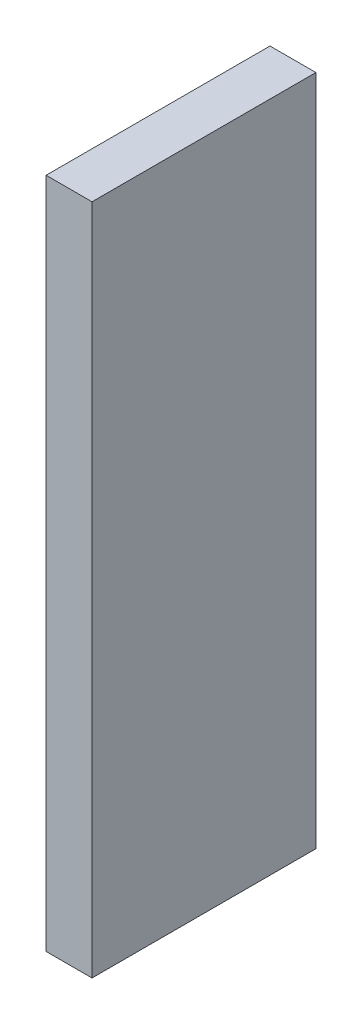
ISO-10303-21;
HEADER;
FILE_DESCRIPTION(('STEP AP214'),'2;1');
FILE_NAME('part.step','',(''),(''),'','','');
FILE_SCHEMA(('AUTOMOTIVE_DESIGN { 1 0 10303 214 1 1 1 1 }'));
ENDSEC;
DATA;
#1=APPLICATION_CONTEXT('core data for automotive mechanical design processes');
#2=APPLICATION_PROTOCOL_DEFINITION('international standard','automotive_design',2000,#1);
#3=PRODUCT_CONTEXT('',#1,'mechanical');
#4=PRODUCT('Part','Part','',(#3));
#5=PRODUCT_RELATED_PRODUCT_CATEGORY('part','',(#4));
#6=PRODUCT_DEFINITION_FORMATION('','',#4);
#7=PRODUCT_DEFINITION_CONTEXT('part definition',#1,'design');
#8=PRODUCT_DEFINITION('design','',#6,#7);
#9=PRODUCT_DEFINITION_SHAPE('','',#8);
#10=(LENGTH_UNIT() NAMED_UNIT(*) SI_UNIT(.MILLI.,.METRE.));
#11=(NAMED_UNIT(*) PLANE_ANGLE_UNIT() SI_UNIT($,.RADIAN.));
#12=(NAMED_UNIT(*) SI_UNIT($,.STERADIAN.) SOLID_ANGLE_UNIT());
#13=UNCERTAINTY_MEASURE_WITH_UNIT(LENGTH_MEASURE(1.E-05),#10,'distance_accuracy_value','');
#14=(GEOMETRIC_REPRESENTATION_CONTEXT(3) GLOBAL_UNCERTAINTY_ASSIGNED_CONTEXT((#13)) GLOBAL_UNIT_ASSIGNED_CONTEXT((#10,
#11,#12)) REPRESENTATION_CONTEXT('',''));
#15=CARTESIAN_POINT('',(0.,0.,0.));
#16=DIRECTION('',(0.,0.,1.));
#17=DIRECTION('',(1.,0.,0.));
#18=AXIS2_PLACEMENT_3D('',#15,#16,#17);
#19=CARTESIAN_POINT('',(-32.5,121.5,19.5));
#20=DIRECTION('',(1.,0.,0.));
#21=DIRECTION('',(0.,0.,-1.));
#22=AXIS2_PLACEMENT_3D('',#19,#20,#21);
#23=PLANE('',#22);
#24=DIRECTION('',(0.,-1.,0.));
#25=VECTOR('',#24,1.);
#26=CARTESIAN_POINT('',(-32.5,121.5,0.));
#27=LINE('',#26,#25);
#28=CARTESIAN_POINT('',(-32.5,180.05,0.));
#29=VERTEX_POINT('',#28);
#30=CARTESIAN_POINT('',(-32.5,121.5,0.));
#31=VERTEX_POINT('',#30);
#32=EDGE_CURVE('E111',#29,#31,#27,.T.);
#33=ORIENTED_EDGE('',*,*,#32,.T.);
#34=DIRECTION('',(0.,0.,-1.));
#35=VECTOR('',#34,1.);
#36=CARTESIAN_POINT('',(-32.5,121.5,19.5));
#37=LINE('',#36,#35);
#38=CARTESIAN_POINT('',(-32.5,121.5,19.5));
#39=VERTEX_POINT('',#38);
#40=EDGE_CURVE('E11',#39,#31,#37,.T.);
#41=ORIENTED_EDGE('',*,*,#40,.F.);
#42=DIRECTION('',(0.,-1.,0.));
#43=VECTOR('',#42,1.);
#44=CARTESIAN_POINT('',(-32.5,121.5,19.5));
#45=LINE('',#44,#43);
#46=CARTESIAN_POINT('',(-32.5,180.05,19.5));
#47=VERTEX_POINT('',#46);
#48=EDGE_CURVE('E93',#47,#39,#45,.T.);
#49=ORIENTED_EDGE('',*,*,#48,.F.);
#50=DIRECTION('',(0.,0.,-1.));
#51=VECTOR('',#50,1.);
#52=CARTESIAN_POINT('',(-32.5,180.05,19.5));
#53=LINE('',#52,#51);
#54=EDGE_CURVE('E107',#47,#29,#53,.T.);
#55=ORIENTED_EDGE('',*,*,#54,.T.);
#56=EDGE_LOOP('',(#33,#41,#49,#55));
#57=FACE_BOUND('',#56,.T.);
#58=ADVANCED_FACE('F42',(#57),#23,.F.);
#59=CARTESIAN_POINT('',(-32.5,121.5,19.5));
#60=DIRECTION('',(0.,1.,0.));
#61=DIRECTION('',(0.,0.,1.));
#62=AXIS2_PLACEMENT_3D('',#59,#60,#61);
#63=PLANE('',#62);
#64=DIRECTION('',(1.,0.,0.));
#65=VECTOR('',#64,1.);
#66=CARTESIAN_POINT('',(-32.5,121.5,0.));
#67=LINE('',#66,#65);
#68=CARTESIAN_POINT('',(-28.5,121.5,0.));
#69=VERTEX_POINT('',#68);
#70=EDGE_CURVE('E99',#31,#69,#67,.T.);
#71=ORIENTED_EDGE('',*,*,#70,.T.);
#72=DIRECTION('',(0.,0.,-1.));
#73=VECTOR('',#72,1.);
#74=CARTESIAN_POINT('',(-28.5,121.5,19.5));
#75=LINE('',#74,#73);
#76=CARTESIAN_POINT('',(-28.5,121.5,19.5));
#77=VERTEX_POINT('',#76);
#78=EDGE_CURVE('E51',#77,#69,#75,.T.);
#79=ORIENTED_EDGE('',*,*,#78,.F.);
#80=DIRECTION('',(1.,0.,0.));
#81=VECTOR('',#80,1.);
#82=CARTESIAN_POINT('',(-32.5,121.5,19.5));
#83=LINE('',#82,#81);
#84=EDGE_CURVE('E88',#39,#77,#83,.T.);
#85=ORIENTED_EDGE('',*,*,#84,.F.);
#86=ORIENTED_EDGE('',*,*,#40,.T.);
#87=EDGE_LOOP('',(#71,#79,#85,#86));
#88=FACE_BOUND('',#87,.T.);
#89=ADVANCED_FACE('F98',(#88),#63,.F.);
#90=CARTESIAN_POINT('',(-28.5,121.5,19.5));
#91=DIRECTION('',(-1.,0.,0.));
#92=DIRECTION('',(0.,0.,1.));
#93=AXIS2_PLACEMENT_3D('',#90,#91,#92);
#94=PLANE('',#93);
#95=ORIENTED_EDGE('',*,*,#78,.T.);
#96=DIRECTION('',(0.,1.,0.));
#97=VECTOR('',#96,1.);
#98=CARTESIAN_POINT('',(-28.5,121.5,0.));
#99=LINE('',#98,#97);
#100=CARTESIAN_POINT('',(-28.5,180.05,0.));
#101=VERTEX_POINT('',#100);
#102=EDGE_CURVE('E75',#69,#101,#99,.T.);
#103=ORIENTED_EDGE('',*,*,#102,.T.);
#104=DIRECTION('',(0.,0.,-1.));
#105=VECTOR('',#104,1.);
#106=CARTESIAN_POINT('',(-28.5,180.05,19.5));
#107=LINE('',#106,#105);
#108=CARTESIAN_POINT('',(-28.5,180.05,19.5));
#109=VERTEX_POINT('',#108);
#110=EDGE_CURVE('E101',#109,#101,#107,.T.);
#111=ORIENTED_EDGE('',*,*,#110,.F.);
#112=DIRECTION('',(0.,1.,0.));
#113=VECTOR('',#112,1.);
#114=CARTESIAN_POINT('',(-28.5,121.5,19.5));
#115=LINE('',#114,#113);
#116=EDGE_CURVE('E91',#77,#109,#115,.T.);
#117=ORIENTED_EDGE('',*,*,#116,.F.);
#118=EDGE_LOOP('',(#95,#103,#111,#117));
#119=FACE_BOUND('',#118,.T.);
#120=ADVANCED_FACE('F102',(#119),#94,.F.);
#121=CARTESIAN_POINT('',(-32.5,180.05,19.5));
#122=DIRECTION('',(0.,-1.,0.));
#123=DIRECTION('',(0.,0.,-1.));
#124=AXIS2_PLACEMENT_3D('',#121,#122,#123);
#125=PLANE('',#124);
#126=DIRECTION('',(-1.,0.,0.));
#127=VECTOR('',#126,1.);
#128=CARTESIAN_POINT('',(-32.5,180.05,0.));
#129=LINE('',#128,#127);
#130=EDGE_CURVE('E81',#101,#29,#129,.T.);
#131=ORIENTED_EDGE('',*,*,#130,.T.);
#132=ORIENTED_EDGE('',*,*,#54,.F.);
#133=DIRECTION('',(-1.,0.,0.));
#134=VECTOR('',#133,1.);
#135=CARTESIAN_POINT('',(-32.5,180.05,19.5));
#136=LINE('',#135,#134);
#137=EDGE_CURVE('E59',#109,#47,#136,.T.);
#138=ORIENTED_EDGE('',*,*,#137,.F.);
#139=ORIENTED_EDGE('',*,*,#110,.T.);
#140=EDGE_LOOP('',(#131,#132,#138,#139));
#141=FACE_BOUND('',#140,.T.);
#142=ADVANCED_FACE('F126',(#141),#125,.F.);
#143=CARTESIAN_POINT('',(0.,0.,19.5));
#144=DIRECTION('',(0.,0.,-1.));
#145=DIRECTION('',(-1.,0.,0.));
#146=AXIS2_PLACEMENT_3D('',#143,#144,#145);
#147=PLANE('',#146);
#148=ORIENTED_EDGE('',*,*,#48,.T.);
#149=ORIENTED_EDGE('',*,*,#84,.T.);
#150=ORIENTED_EDGE('',*,*,#116,.T.);
#151=ORIENTED_EDGE('',*,*,#137,.T.);
#152=EDGE_LOOP('',(#148,#149,#150,#151));
#153=FACE_BOUND('',#152,.T.);
#154=ADVANCED_FACE('F89',(#153),#147,.F.);
#155=CARTESIAN_POINT('',(0.,0.,0.));
#156=DIRECTION('',(0.,0.,-1.));
#157=DIRECTION('',(-1.,0.,0.));
#158=AXIS2_PLACEMENT_3D('',#155,#156,#157);
#159=PLANE('',#158);
#160=ORIENTED_EDGE('',*,*,#32,.F.);
#161=ORIENTED_EDGE('',*,*,#130,.F.);
#162=ORIENTED_EDGE('',*,*,#102,.F.);
#163=ORIENTED_EDGE('',*,*,#70,.F.);
#164=EDGE_LOOP('',(#160,#161,#162,#163));
#165=FACE_BOUND('',#164,.T.);
#166=ADVANCED_FACE('F129',(#165),#159,.T.);
#167=CLOSED_SHELL('',(#58,#89,#120,#142,#154,#166));
#168=MANIFOLD_SOLID_BREP('B2',#167);
#169=ADVANCED_BREP_SHAPE_REPRESENTATION('',(#18,#168),#14);
#170=SHAPE_DEFINITION_REPRESENTATION(#9,#169);
ENDSEC;
END-ISO-10303-21;
